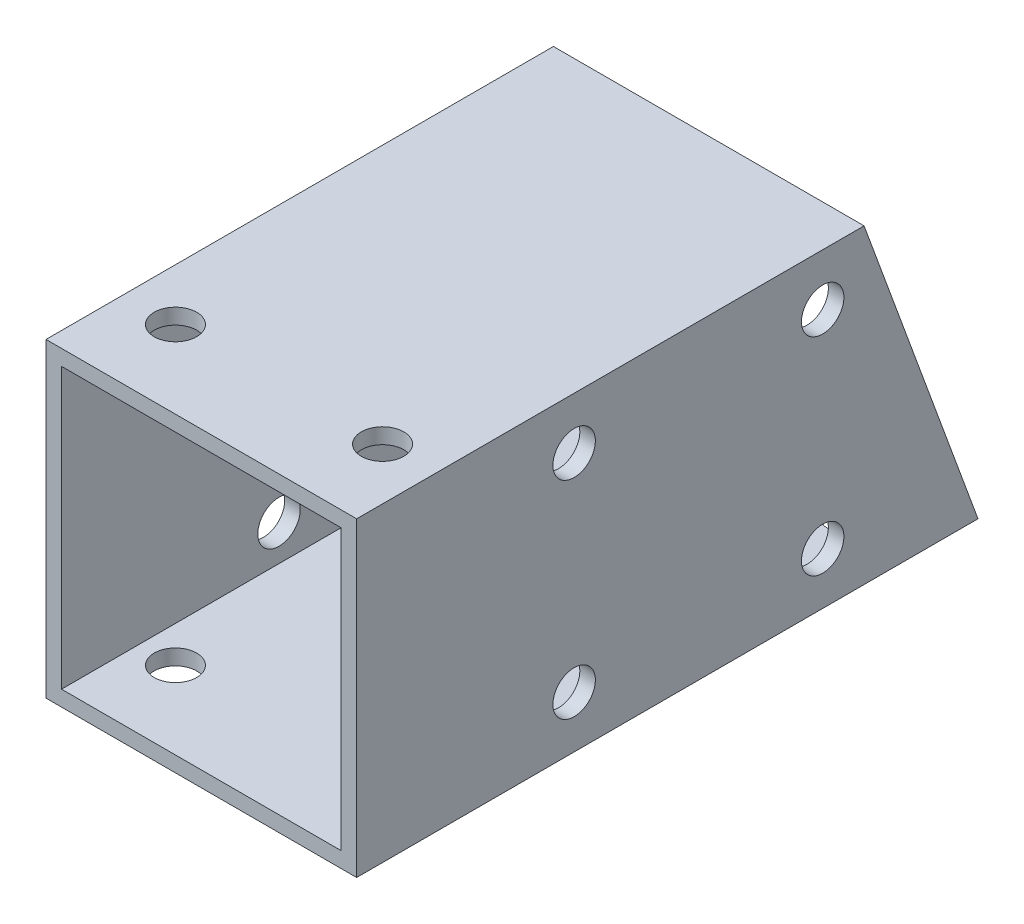
ISO-10303-21;
HEADER;
FILE_DESCRIPTION(('STEP AP214'),'2;1');
FILE_NAME('part.step','',(''),(''),'','','');
FILE_SCHEMA(('AUTOMOTIVE_DESIGN { 1 0 10303 214 1 1 1 1 }'));
ENDSEC;
DATA;
#1=APPLICATION_CONTEXT('core data for automotive mechanical design processes');
#2=APPLICATION_PROTOCOL_DEFINITION('international standard','automotive_design',2000,#1);
#3=PRODUCT_CONTEXT('',#1,'mechanical');
#4=PRODUCT('Part','Part','',(#3));
#5=PRODUCT_RELATED_PRODUCT_CATEGORY('part','',(#4));
#6=PRODUCT_DEFINITION_FORMATION('','',#4);
#7=PRODUCT_DEFINITION_CONTEXT('part definition',#1,'design');
#8=PRODUCT_DEFINITION('design','',#6,#7);
#9=PRODUCT_DEFINITION_SHAPE('','',#8);
#10=(LENGTH_UNIT() NAMED_UNIT(*) SI_UNIT(.MILLI.,.METRE.));
#11=(NAMED_UNIT(*) PLANE_ANGLE_UNIT() SI_UNIT($,.RADIAN.));
#12=(NAMED_UNIT(*) SI_UNIT($,.STERADIAN.) SOLID_ANGLE_UNIT());
#13=UNCERTAINTY_MEASURE_WITH_UNIT(LENGTH_MEASURE(1.E-05),#10,'distance_accuracy_value','');
#14=(GEOMETRIC_REPRESENTATION_CONTEXT(3) GLOBAL_UNCERTAINTY_ASSIGNED_CONTEXT((#13)) GLOBAL_UNIT_ASSIGNED_CONTEXT((#10,
#11,#12)) REPRESENTATION_CONTEXT('',''));
#15=CARTESIAN_POINT('',(0.,0.,0.));
#16=DIRECTION('',(0.,0.,1.));
#17=DIRECTION('',(1.,0.,0.));
#18=AXIS2_PLACEMENT_3D('',#15,#16,#17);
#19=CARTESIAN_POINT('',(0.,0.,60.));
#20=DIRECTION('',(0.,0.,1.));
#21=DIRECTION('',(1.,0.,0.));
#22=AXIS2_PLACEMENT_3D('',#19,#20,#21);
#23=PLANE('',#22);
#24=DIRECTION('',(0.,1.,0.));
#25=VECTOR('',#24,1.);
#26=CARTESIAN_POINT('',(15.,15.,60.));
#27=LINE('',#26,#25);
#28=CARTESIAN_POINT('',(15.,-15.,60.));
#29=VERTEX_POINT('',#28);
#30=CARTESIAN_POINT('',(15.,15.,60.));
#31=VERTEX_POINT('',#30);
#32=EDGE_CURVE('E214',#29,#31,#27,.T.);
#33=ORIENTED_EDGE('',*,*,#32,.T.);
#34=DIRECTION('',(-1.,0.,0.));
#35=VECTOR('',#34,1.);
#36=CARTESIAN_POINT('',(-15.,15.,60.));
#37=LINE('',#36,#35);
#38=CARTESIAN_POINT('',(-15.,15.,60.));
#39=VERTEX_POINT('',#38);
#40=EDGE_CURVE('E217',#31,#39,#37,.T.);
#41=ORIENTED_EDGE('',*,*,#40,.T.);
#42=DIRECTION('',(0.,-1.,0.));
#43=VECTOR('',#42,1.);
#44=CARTESIAN_POINT('',(-15.,15.,60.));
#45=LINE('',#44,#43);
#46=CARTESIAN_POINT('',(-15.,-15.,60.));
#47=VERTEX_POINT('',#46);
#48=EDGE_CURVE('E126',#39,#47,#45,.T.);
#49=ORIENTED_EDGE('',*,*,#48,.T.);
#50=DIRECTION('',(1.,0.,0.));
#51=VECTOR('',#50,1.);
#52=CARTESIAN_POINT('',(-15.,-15.,60.));
#53=LINE('',#52,#51);
#54=EDGE_CURVE('E220',#47,#29,#53,.T.);
#55=ORIENTED_EDGE('',*,*,#54,.T.);
#56=EDGE_LOOP('',(#33,#41,#49,#55));
#57=FACE_BOUND('',#56,.T.);
#58=DIRECTION('',(0.,-1.,0.));
#59=VECTOR('',#58,1.);
#60=CARTESIAN_POINT('',(-13.5,13.5,60.));
#61=LINE('',#60,#59);
#62=CARTESIAN_POINT('',(-13.5,13.5,60.));
#63=VERTEX_POINT('',#62);
#64=CARTESIAN_POINT('',(-13.5,-13.5,60.));
#65=VERTEX_POINT('',#64);
#66=EDGE_CURVE('E198',#63,#65,#61,.T.);
#67=ORIENTED_EDGE('',*,*,#66,.F.);
#68=DIRECTION('',(-1.,0.,0.));
#69=VECTOR('',#68,1.);
#70=CARTESIAN_POINT('',(-13.5,13.5,60.));
#71=LINE('',#70,#69);
#72=CARTESIAN_POINT('',(13.5,13.5,60.));
#73=VERTEX_POINT('',#72);
#74=EDGE_CURVE('E149',#73,#63,#71,.T.);
#75=ORIENTED_EDGE('',*,*,#74,.F.);
#76=DIRECTION('',(0.,1.,0.));
#77=VECTOR('',#76,1.);
#78=CARTESIAN_POINT('',(13.5,13.5,60.));
#79=LINE('',#78,#77);
#80=CARTESIAN_POINT('',(13.5,-13.5,60.));
#81=VERTEX_POINT('',#80);
#82=EDGE_CURVE('E202',#81,#73,#79,.T.);
#83=ORIENTED_EDGE('',*,*,#82,.F.);
#84=DIRECTION('',(1.,0.,0.));
#85=VECTOR('',#84,1.);
#86=CARTESIAN_POINT('',(-13.5,-13.5,60.));
#87=LINE('',#86,#85);
#88=EDGE_CURVE('E200',#65,#81,#87,.T.);
#89=ORIENTED_EDGE('',*,*,#88,.F.);
#90=EDGE_LOOP('',(#67,#75,#83,#89));
#91=FACE_BOUND('',#90,.T.);
#92=ADVANCED_FACE('F41',(#57,#91),#23,.T.);
#93=CARTESIAN_POINT('',(15.,15.,60.));
#94=DIRECTION('',(-1.,0.,0.));
#95=DIRECTION('',(0.,-1.,0.));
#96=AXIS2_PLACEMENT_3D('',#93,#94,#95);
#97=PLANE('',#96);
#98=CARTESIAN_POINT('',(15.,10.,15.));
#99=DIRECTION('',(1.,0.,0.));
#100=DIRECTION('',(0.,1.,0.));
#101=AXIS2_PLACEMENT_3D('',#98,#99,#100);
#102=CIRCLE('',#101,2.05);
#103=CARTESIAN_POINT('',(15.,12.05,15.));
#104=VERTEX_POINT('',#103);
#105=EDGE_CURVE('E267',#104,#104,#102,.T.);
#106=ORIENTED_EDGE('',*,*,#105,.F.);
#107=EDGE_LOOP('',(#106));
#108=FACE_BOUND('',#107,.T.);
#109=CARTESIAN_POINT('',(15.,-10.,15.));
#110=DIRECTION('',(1.,0.,0.));
#111=DIRECTION('',(0.,1.,0.));
#112=AXIS2_PLACEMENT_3D('',#109,#110,#111);
#113=CIRCLE('',#112,2.05);
#114=CARTESIAN_POINT('',(15.,-7.95,15.));
#115=VERTEX_POINT('',#114);
#116=EDGE_CURVE('E261',#115,#115,#113,.T.);
#117=ORIENTED_EDGE('',*,*,#116,.F.);
#118=EDGE_LOOP('',(#117));
#119=FACE_BOUND('',#118,.T.);
#120=CARTESIAN_POINT('',(15.,-10.,39.));
#121=DIRECTION('',(1.,0.,0.));
#122=DIRECTION('',(0.,1.,0.));
#123=AXIS2_PLACEMENT_3D('',#120,#121,#122);
#124=CIRCLE('',#123,2.05);
#125=CARTESIAN_POINT('',(15.,-7.95,39.));
#126=VERTEX_POINT('',#125);
#127=EDGE_CURVE('E254',#126,#126,#124,.T.);
#128=ORIENTED_EDGE('',*,*,#127,.F.);
#129=EDGE_LOOP('',(#128));
#130=FACE_BOUND('',#129,.T.);
#131=CARTESIAN_POINT('',(15.,10.,39.));
#132=DIRECTION('',(1.,0.,0.));
#133=DIRECTION('',(0.,1.,0.));
#134=AXIS2_PLACEMENT_3D('',#131,#132,#133);
#135=CIRCLE('',#134,2.05);
#136=CARTESIAN_POINT('',(15.,12.05,39.));
#137=VERTEX_POINT('',#136);
#138=EDGE_CURVE('E257',#137,#137,#135,.T.);
#139=ORIENTED_EDGE('',*,*,#138,.F.);
#140=EDGE_LOOP('',(#139));
#141=FACE_BOUND('',#140,.T.);
#142=DIRECTION('',(0.,0.,-1.));
#143=VECTOR('',#142,1.);
#144=CARTESIAN_POINT('',(15.,-15.,60.));
#145=LINE('',#144,#143);
#146=CARTESIAN_POINT('',(15.,-15.,0.));
#147=VERTEX_POINT('',#146);
#148=EDGE_CURVE('E130',#29,#147,#145,.T.);
#149=ORIENTED_EDGE('',*,*,#148,.T.);
#150=DIRECTION('',(0.,-0.938876315886608,-0.344254649158423));
#151=VECTOR('',#150,1.);
#152=CARTESIAN_POINT('',(15.,-15.,0.));
#153=LINE('',#152,#151);
#154=CARTESIAN_POINT('',(15.,15.,11.));
#155=VERTEX_POINT('',#154);
#156=EDGE_CURVE('E115',#155,#147,#153,.T.);
#157=ORIENTED_EDGE('',*,*,#156,.F.);
#158=DIRECTION('',(0.,0.,-1.));
#159=VECTOR('',#158,1.);
#160=CARTESIAN_POINT('',(15.,15.,60.));
#161=LINE('',#160,#159);
#162=EDGE_CURVE('E49',#31,#155,#161,.T.);
#163=ORIENTED_EDGE('',*,*,#162,.F.);
#164=ORIENTED_EDGE('',*,*,#32,.F.);
#165=EDGE_LOOP('',(#149,#157,#163,#164));
#166=FACE_BOUND('',#165,.T.);
#167=ADVANCED_FACE('F43',(#108,#119,#130,#141,#166),#97,.F.);
#168=CARTESIAN_POINT('',(-15.,15.,60.));
#169=DIRECTION('',(0.,-1.,0.));
#170=DIRECTION('',(1.,0.,0.));
#171=AXIS2_PLACEMENT_3D('',#168,#169,#170);
#172=PLANE('',#171);
#173=CARTESIAN_POINT('',(-9.99999999999999,15.,52.5));
#174=DIRECTION('',(0.,1.,0.));
#175=DIRECTION('',(0.,0.,1.));
#176=AXIS2_PLACEMENT_3D('',#173,#174,#175);
#177=CIRCLE('',#176,2.05);
#178=CARTESIAN_POINT('',(-9.99999999999999,15.,54.55));
#179=VERTEX_POINT('',#178);
#180=EDGE_CURVE('E186',#179,#179,#177,.T.);
#181=ORIENTED_EDGE('',*,*,#180,.F.);
#182=EDGE_LOOP('',(#181));
#183=FACE_BOUND('',#182,.T.);
#184=CARTESIAN_POINT('',(10.,15.,52.5));
#185=DIRECTION('',(0.,1.,0.));
#186=DIRECTION('',(0.,0.,1.));
#187=AXIS2_PLACEMENT_3D('',#184,#185,#186);
#188=CIRCLE('',#187,2.05);
#189=CARTESIAN_POINT('',(10.,15.,54.55));
#190=VERTEX_POINT('',#189);
#191=EDGE_CURVE('E177',#190,#190,#188,.T.);
#192=ORIENTED_EDGE('',*,*,#191,.F.);
#193=EDGE_LOOP('',(#192));
#194=FACE_BOUND('',#193,.T.);
#195=ORIENTED_EDGE('',*,*,#162,.T.);
#196=DIRECTION('',(1.,0.,0.));
#197=VECTOR('',#196,1.);
#198=CARTESIAN_POINT('',(-15.,15.,11.));
#199=LINE('',#198,#197);
#200=CARTESIAN_POINT('',(-15.,15.,11.));
#201=VERTEX_POINT('',#200);
#202=EDGE_CURVE('E107',#201,#155,#199,.T.);
#203=ORIENTED_EDGE('',*,*,#202,.F.);
#204=DIRECTION('',(0.,0.,-1.));
#205=VECTOR('',#204,1.);
#206=CARTESIAN_POINT('',(-15.,15.,60.));
#207=LINE('',#206,#205);
#208=EDGE_CURVE('E121',#39,#201,#207,.T.);
#209=ORIENTED_EDGE('',*,*,#208,.F.);
#210=ORIENTED_EDGE('',*,*,#40,.F.);
#211=EDGE_LOOP('',(#195,#203,#209,#210));
#212=FACE_BOUND('',#211,.T.);
#213=ADVANCED_FACE('F120',(#183,#194,#212),#172,.F.);
#214=CARTESIAN_POINT('',(-15.,15.,60.));
#215=DIRECTION('',(1.,0.,0.));
#216=DIRECTION('',(0.,1.,0.));
#217=AXIS2_PLACEMENT_3D('',#214,#215,#216);
#218=PLANE('',#217);
#219=CARTESIAN_POINT('',(-15.,10.,15.));
#220=DIRECTION('',(1.,0.,0.));
#221=DIRECTION('',(0.,1.,0.));
#222=AXIS2_PLACEMENT_3D('',#219,#220,#221);
#223=CIRCLE('',#222,2.05);
#224=CARTESIAN_POINT('',(-15.,12.05,15.));
#225=VERTEX_POINT('',#224);
#226=EDGE_CURVE('E253',#225,#225,#223,.T.);
#227=ORIENTED_EDGE('',*,*,#226,.T.);
#228=EDGE_LOOP('',(#227));
#229=FACE_BOUND('',#228,.T.);
#230=CARTESIAN_POINT('',(-15.,-10.,15.));
#231=DIRECTION('',(1.,0.,0.));
#232=DIRECTION('',(0.,1.,0.));
#233=AXIS2_PLACEMENT_3D('',#230,#231,#232);
#234=CIRCLE('',#233,2.05);
#235=CARTESIAN_POINT('',(-15.,-7.95,15.));
#236=VERTEX_POINT('',#235);
#237=EDGE_CURVE('E264',#236,#236,#234,.T.);
#238=ORIENTED_EDGE('',*,*,#237,.T.);
#239=EDGE_LOOP('',(#238));
#240=FACE_BOUND('',#239,.T.);
#241=CARTESIAN_POINT('',(-15.,-10.,39.));
#242=DIRECTION('',(1.,0.,0.));
#243=DIRECTION('',(0.,1.,0.));
#244=AXIS2_PLACEMENT_3D('',#241,#242,#243);
#245=CIRCLE('',#244,2.05);
#246=CARTESIAN_POINT('',(-15.,-7.95,39.));
#247=VERTEX_POINT('',#246);
#248=EDGE_CURVE('E258',#247,#247,#245,.T.);
#249=ORIENTED_EDGE('',*,*,#248,.T.);
#250=EDGE_LOOP('',(#249));
#251=FACE_BOUND('',#250,.T.);
#252=CARTESIAN_POINT('',(-15.,10.,39.));
#253=DIRECTION('',(1.,0.,0.));
#254=DIRECTION('',(0.,1.,0.));
#255=AXIS2_PLACEMENT_3D('',#252,#253,#254);
#256=CIRCLE('',#255,2.05);
#257=CARTESIAN_POINT('',(-15.,12.05,39.));
#258=VERTEX_POINT('',#257);
#259=EDGE_CURVE('E154',#258,#258,#256,.T.);
#260=ORIENTED_EDGE('',*,*,#259,.T.);
#261=EDGE_LOOP('',(#260));
#262=FACE_BOUND('',#261,.T.);
#263=ORIENTED_EDGE('',*,*,#208,.T.);
#264=DIRECTION('',(0.,-0.938876315886608,-0.344254649158423));
#265=VECTOR('',#264,1.);
#266=CARTESIAN_POINT('',(-15.,-15.,0.));
#267=LINE('',#266,#265);
#268=CARTESIAN_POINT('',(-15.,-15.,0.));
#269=VERTEX_POINT('',#268);
#270=EDGE_CURVE('E104',#201,#269,#267,.T.);
#271=ORIENTED_EDGE('',*,*,#270,.T.);
#272=DIRECTION('',(0.,0.,-1.));
#273=VECTOR('',#272,1.);
#274=CARTESIAN_POINT('',(-15.,-15.,60.));
#275=LINE('',#274,#273);
#276=EDGE_CURVE('E127',#47,#269,#275,.T.);
#277=ORIENTED_EDGE('',*,*,#276,.F.);
#278=ORIENTED_EDGE('',*,*,#48,.F.);
#279=EDGE_LOOP('',(#263,#271,#277,#278));
#280=FACE_BOUND('',#279,.T.);
#281=ADVANCED_FACE('F125',(#229,#240,#251,#262,#280),#218,.F.);
#282=CARTESIAN_POINT('',(-15.,-15.,60.));
#283=DIRECTION('',(0.,1.,0.));
#284=DIRECTION('',(0.,0.,1.));
#285=AXIS2_PLACEMENT_3D('',#282,#283,#284);
#286=PLANE('',#285);
#287=CARTESIAN_POINT('',(10.,-15.,7.50000000000001));
#288=DIRECTION('',(0.,1.,0.));
#289=DIRECTION('',(0.,0.,1.));
#290=AXIS2_PLACEMENT_3D('',#287,#288,#289);
#291=CIRCLE('',#290,2.05);
#292=CARTESIAN_POINT('',(10.,-15.,9.55000000000001));
#293=VERTEX_POINT('',#292);
#294=EDGE_CURVE('E183',#293,#293,#291,.T.);
#295=ORIENTED_EDGE('',*,*,#294,.T.);
#296=EDGE_LOOP('',(#295));
#297=FACE_BOUND('',#296,.T.);
#298=CARTESIAN_POINT('',(-9.99999999999999,-15.,52.5));
#299=DIRECTION('',(0.,1.,0.));
#300=DIRECTION('',(0.,0.,1.));
#301=AXIS2_PLACEMENT_3D('',#298,#299,#300);
#302=CIRCLE('',#301,2.05);
#303=CARTESIAN_POINT('',(-9.99999999999999,-15.,54.55));
#304=VERTEX_POINT('',#303);
#305=EDGE_CURVE('E180',#304,#304,#302,.T.);
#306=ORIENTED_EDGE('',*,*,#305,.T.);
#307=EDGE_LOOP('',(#306));
#308=FACE_BOUND('',#307,.T.);
#309=CARTESIAN_POINT('',(10.,-15.,52.5));
#310=DIRECTION('',(0.,1.,0.));
#311=DIRECTION('',(0.,0.,1.));
#312=AXIS2_PLACEMENT_3D('',#309,#310,#311);
#313=CIRCLE('',#312,2.05);
#314=CARTESIAN_POINT('',(10.,-15.,54.55));
#315=VERTEX_POINT('',#314);
#316=EDGE_CURVE('E168',#315,#315,#313,.T.);
#317=ORIENTED_EDGE('',*,*,#316,.T.);
#318=EDGE_LOOP('',(#317));
#319=FACE_BOUND('',#318,.T.);
#320=CARTESIAN_POINT('',(-9.99999999999999,-15.,7.50000000000001));
#321=DIRECTION('',(0.,1.,0.));
#322=DIRECTION('',(0.,0.,1.));
#323=AXIS2_PLACEMENT_3D('',#320,#321,#322);
#324=CIRCLE('',#323,2.05);
#325=CARTESIAN_POINT('',(-9.99999999999999,-15.,9.55000000000001));
#326=VERTEX_POINT('',#325);
#327=EDGE_CURVE('E138',#326,#326,#324,.T.);
#328=ORIENTED_EDGE('',*,*,#327,.T.);
#329=EDGE_LOOP('',(#328));
#330=FACE_BOUND('',#329,.T.);
#331=DIRECTION('',(1.,0.,0.));
#332=VECTOR('',#331,1.);
#333=CARTESIAN_POINT('',(-15.,-15.,0.));
#334=LINE('',#333,#332);
#335=EDGE_CURVE('E110',#269,#147,#334,.T.);
#336=ORIENTED_EDGE('',*,*,#335,.T.);
#337=ORIENTED_EDGE('',*,*,#148,.F.);
#338=ORIENTED_EDGE('',*,*,#54,.F.);
#339=ORIENTED_EDGE('',*,*,#276,.T.);
#340=EDGE_LOOP('',(#336,#337,#338,#339));
#341=FACE_BOUND('',#340,.T.);
#342=ADVANCED_FACE('F228',(#297,#308,#319,#330,#341),#286,.F.);
#343=CARTESIAN_POINT('',(-13.5,13.5,60.));
#344=DIRECTION('',(0.,-1.,0.));
#345=DIRECTION('',(0.,0.,-1.));
#346=AXIS2_PLACEMENT_3D('',#343,#344,#345);
#347=PLANE('',#346);
#348=DIRECTION('',(-1.,0.,0.));
#349=VECTOR('',#348,1.);
#350=CARTESIAN_POINT('',(-13.5,13.5,10.45));
#351=LINE('',#350,#349);
#352=CARTESIAN_POINT('',(13.5,13.5,10.45));
#353=VERTEX_POINT('',#352);
#354=CARTESIAN_POINT('',(-13.5,13.5,10.45));
#355=VERTEX_POINT('',#354);
#356=EDGE_CURVE('E248',#353,#355,#351,.T.);
#357=ORIENTED_EDGE('',*,*,#356,.F.);
#358=DIRECTION('',(0.,0.,-1.));
#359=VECTOR('',#358,1.);
#360=CARTESIAN_POINT('',(13.5,13.5,60.));
#361=LINE('',#360,#359);
#362=EDGE_CURVE('E204',#73,#353,#361,.T.);
#363=ORIENTED_EDGE('',*,*,#362,.F.);
#364=ORIENTED_EDGE('',*,*,#74,.T.);
#365=DIRECTION('',(0.,0.,-1.));
#366=VECTOR('',#365,1.);
#367=CARTESIAN_POINT('',(-13.5,13.5,60.));
#368=LINE('',#367,#366);
#369=EDGE_CURVE('E211',#63,#355,#368,.T.);
#370=ORIENTED_EDGE('',*,*,#369,.T.);
#371=EDGE_LOOP('',(#357,#363,#364,#370));
#372=FACE_BOUND('',#371,.T.);
#373=CARTESIAN_POINT('',(-9.99999999999999,13.5,52.5));
#374=DIRECTION('',(0.,-1.,0.));
#375=DIRECTION('',(0.,0.,-1.));
#376=AXIS2_PLACEMENT_3D('',#373,#374,#375);
#377=CIRCLE('',#376,2.05);
#378=CARTESIAN_POINT('',(-9.99999999999999,13.5,50.45));
#379=VERTEX_POINT('',#378);
#380=EDGE_CURVE('E145',#379,#379,#377,.T.);
#381=ORIENTED_EDGE('',*,*,#380,.F.);
#382=EDGE_LOOP('',(#381));
#383=FACE_BOUND('',#382,.T.);
#384=CARTESIAN_POINT('',(10.,13.5,52.5));
#385=DIRECTION('',(0.,-1.,0.));
#386=DIRECTION('',(0.,0.,-1.));
#387=AXIS2_PLACEMENT_3D('',#384,#385,#386);
#388=CIRCLE('',#387,2.05);
#389=CARTESIAN_POINT('',(10.,13.5,50.45));
#390=VERTEX_POINT('',#389);
#391=EDGE_CURVE('E141',#390,#390,#388,.T.);
#392=ORIENTED_EDGE('',*,*,#391,.F.);
#393=EDGE_LOOP('',(#392));
#394=FACE_BOUND('',#393,.T.);
#395=ADVANCED_FACE('F282',(#372,#383,#394),#347,.T.);
#396=CARTESIAN_POINT('',(-13.5,13.5,60.));
#397=DIRECTION('',(1.,0.,0.));
#398=DIRECTION('',(0.,1.,0.));
#399=AXIS2_PLACEMENT_3D('',#396,#397,#398);
#400=PLANE('',#399);
#401=DIRECTION('',(0.,-0.938876315886609,-0.344254649158423));
#402=VECTOR('',#401,1.);
#403=CARTESIAN_POINT('',(-13.5,29.515181194907,16.3222331047992));
#404=LINE('',#403,#402);
#405=CARTESIAN_POINT('',(-13.5,-13.5,0.549999999999995));
#406=VERTEX_POINT('',#405);
#407=EDGE_CURVE('E246',#355,#406,#404,.T.);
#408=ORIENTED_EDGE('',*,*,#407,.F.);
#409=ORIENTED_EDGE('',*,*,#369,.F.);
#410=ORIENTED_EDGE('',*,*,#66,.T.);
#411=DIRECTION('',(0.,0.,-1.));
#412=VECTOR('',#411,1.);
#413=CARTESIAN_POINT('',(-13.5,-13.5,60.));
#414=LINE('',#413,#412);
#415=EDGE_CURVE('E208',#65,#406,#414,.T.);
#416=ORIENTED_EDGE('',*,*,#415,.T.);
#417=EDGE_LOOP('',(#408,#409,#410,#416));
#418=FACE_BOUND('',#417,.T.);
#419=CARTESIAN_POINT('',(-13.5,10.,15.));
#420=DIRECTION('',(1.,0.,0.));
#421=DIRECTION('',(0.,1.,0.));
#422=AXIS2_PLACEMENT_3D('',#419,#420,#421);
#423=CIRCLE('',#422,2.05);
#424=CARTESIAN_POINT('',(-13.5,12.05,15.));
#425=VERTEX_POINT('',#424);
#426=EDGE_CURVE('E164',#425,#425,#423,.T.);
#427=ORIENTED_EDGE('',*,*,#426,.F.);
#428=EDGE_LOOP('',(#427));
#429=FACE_BOUND('',#428,.T.);
#430=CARTESIAN_POINT('',(-13.5,-10.,15.));
#431=DIRECTION('',(1.,0.,0.));
#432=DIRECTION('',(0.,1.,0.));
#433=AXIS2_PLACEMENT_3D('',#430,#431,#432);
#434=CIRCLE('',#433,2.05);
#435=CARTESIAN_POINT('',(-13.5,-7.95,15.));
#436=VERTEX_POINT('',#435);
#437=EDGE_CURVE('E161',#436,#436,#434,.T.);
#438=ORIENTED_EDGE('',*,*,#437,.F.);
#439=EDGE_LOOP('',(#438));
#440=FACE_BOUND('',#439,.T.);
#441=CARTESIAN_POINT('',(-13.5,-10.,39.));
#442=DIRECTION('',(1.,0.,0.));
#443=DIRECTION('',(0.,1.,0.));
#444=AXIS2_PLACEMENT_3D('',#441,#442,#443);
#445=CIRCLE('',#444,2.05);
#446=CARTESIAN_POINT('',(-13.5,-7.95,39.));
#447=VERTEX_POINT('',#446);
#448=EDGE_CURVE('E158',#447,#447,#445,.T.);
#449=ORIENTED_EDGE('',*,*,#448,.F.);
#450=EDGE_LOOP('',(#449));
#451=FACE_BOUND('',#450,.T.);
#452=CARTESIAN_POINT('',(-13.5,10.,39.));
#453=DIRECTION('',(1.,0.,0.));
#454=DIRECTION('',(0.,1.,0.));
#455=AXIS2_PLACEMENT_3D('',#452,#453,#454);
#456=CIRCLE('',#455,2.05);
#457=CARTESIAN_POINT('',(-13.5,12.05,39.));
#458=VERTEX_POINT('',#457);
#459=EDGE_CURVE('E153',#458,#458,#456,.T.);
#460=ORIENTED_EDGE('',*,*,#459,.F.);
#461=EDGE_LOOP('',(#460));
#462=FACE_BOUND('',#461,.T.);
#463=ADVANCED_FACE('F241',(#418,#429,#440,#451,#462),#400,.T.);
#464=CARTESIAN_POINT('',(-13.5,-13.5,60.));
#465=DIRECTION('',(0.,1.,0.));
#466=DIRECTION('',(0.,0.,1.));
#467=AXIS2_PLACEMENT_3D('',#464,#465,#466);
#468=PLANE('',#467);
#469=DIRECTION('',(1.,0.,0.));
#470=VECTOR('',#469,1.);
#471=CARTESIAN_POINT('',(-13.5,-13.5,0.549999999999995));
#472=LINE('',#471,#470);
#473=CARTESIAN_POINT('',(13.5,-13.5,0.55));
#474=VERTEX_POINT('',#473);
#475=EDGE_CURVE('E55',#406,#474,#472,.T.);
#476=ORIENTED_EDGE('',*,*,#475,.F.);
#477=ORIENTED_EDGE('',*,*,#415,.F.);
#478=ORIENTED_EDGE('',*,*,#88,.T.);
#479=DIRECTION('',(0.,0.,-1.));
#480=VECTOR('',#479,1.);
#481=CARTESIAN_POINT('',(13.5,-13.5,60.));
#482=LINE('',#481,#480);
#483=EDGE_CURVE('E62',#81,#474,#482,.T.);
#484=ORIENTED_EDGE('',*,*,#483,.T.);
#485=EDGE_LOOP('',(#476,#477,#478,#484));
#486=FACE_BOUND('',#485,.T.);
#487=CARTESIAN_POINT('',(10.,-13.5,7.50000000000001));
#488=DIRECTION('',(0.,1.,0.));
#489=DIRECTION('',(0.,0.,1.));
#490=AXIS2_PLACEMENT_3D('',#487,#488,#489);
#491=CIRCLE('',#490,2.05);
#492=CARTESIAN_POINT('',(10.,-13.5,9.55000000000001));
#493=VERTEX_POINT('',#492);
#494=EDGE_CURVE('E146',#493,#493,#491,.T.);
#495=ORIENTED_EDGE('',*,*,#494,.F.);
#496=EDGE_LOOP('',(#495));
#497=FACE_BOUND('',#496,.T.);
#498=CARTESIAN_POINT('',(-9.99999999999999,-13.5,52.5));
#499=DIRECTION('',(0.,1.,0.));
#500=DIRECTION('',(0.,0.,1.));
#501=AXIS2_PLACEMENT_3D('',#498,#499,#500);
#502=CIRCLE('',#501,2.05);
#503=CARTESIAN_POINT('',(-9.99999999999999,-13.5,54.55));
#504=VERTEX_POINT('',#503);
#505=EDGE_CURVE('E142',#504,#504,#502,.T.);
#506=ORIENTED_EDGE('',*,*,#505,.F.);
#507=EDGE_LOOP('',(#506));
#508=FACE_BOUND('',#507,.T.);
#509=CARTESIAN_POINT('',(10.,-13.5,52.5));
#510=DIRECTION('',(0.,1.,0.));
#511=DIRECTION('',(0.,0.,1.));
#512=AXIS2_PLACEMENT_3D('',#509,#510,#511);
#513=CIRCLE('',#512,2.05);
#514=CARTESIAN_POINT('',(10.,-13.5,54.55));
#515=VERTEX_POINT('',#514);
#516=EDGE_CURVE('E137',#515,#515,#513,.T.);
#517=ORIENTED_EDGE('',*,*,#516,.F.);
#518=EDGE_LOOP('',(#517));
#519=FACE_BOUND('',#518,.T.);
#520=CARTESIAN_POINT('',(-9.99999999999999,-13.5,7.50000000000001));
#521=DIRECTION('',(0.,1.,0.));
#522=DIRECTION('',(0.,0.,1.));
#523=AXIS2_PLACEMENT_3D('',#520,#521,#522);
#524=CIRCLE('',#523,2.05);
#525=CARTESIAN_POINT('',(-9.99999999999999,-13.5,9.55000000000001));
#526=VERTEX_POINT('',#525);
#527=EDGE_CURVE('E134',#526,#526,#524,.T.);
#528=ORIENTED_EDGE('',*,*,#527,.F.);
#529=EDGE_LOOP('',(#528));
#530=FACE_BOUND('',#529,.T.);
#531=ADVANCED_FACE('F244',(#486,#497,#508,#519,#530),#468,.T.);
#532=CARTESIAN_POINT('',(13.5,13.5,60.));
#533=DIRECTION('',(-1.,0.,0.));
#534=DIRECTION('',(0.,-1.,0.));
#535=AXIS2_PLACEMENT_3D('',#532,#533,#534);
#536=PLANE('',#535);
#537=DIRECTION('',(0.,0.938876315886609,0.344254649158423));
#538=VECTOR('',#537,1.);
#539=CARTESIAN_POINT('',(13.5,29.515181194907,16.3222331047992));
#540=LINE('',#539,#538);
#541=EDGE_CURVE('E11',#474,#353,#540,.T.);
#542=ORIENTED_EDGE('',*,*,#541,.F.);
#543=ORIENTED_EDGE('',*,*,#483,.F.);
#544=ORIENTED_EDGE('',*,*,#82,.T.);
#545=ORIENTED_EDGE('',*,*,#362,.T.);
#546=EDGE_LOOP('',(#542,#543,#544,#545));
#547=FACE_BOUND('',#546,.T.);
#548=CARTESIAN_POINT('',(13.5,10.,15.));
#549=DIRECTION('',(-1.,0.,0.));
#550=DIRECTION('',(0.,-1.,0.));
#551=AXIS2_PLACEMENT_3D('',#548,#549,#550);
#552=CIRCLE('',#551,2.05);
#553=CARTESIAN_POINT('',(13.5,7.95,15.));
#554=VERTEX_POINT('',#553);
#555=EDGE_CURVE('E162',#554,#554,#552,.T.);
#556=ORIENTED_EDGE('',*,*,#555,.F.);
#557=EDGE_LOOP('',(#556));
#558=FACE_BOUND('',#557,.T.);
#559=CARTESIAN_POINT('',(13.5,-10.,15.));
#560=DIRECTION('',(-1.,0.,0.));
#561=DIRECTION('',(0.,-1.,0.));
#562=AXIS2_PLACEMENT_3D('',#559,#560,#561);
#563=CIRCLE('',#562,2.05);
#564=CARTESIAN_POINT('',(13.5,-12.05,15.));
#565=VERTEX_POINT('',#564);
#566=EDGE_CURVE('E159',#565,#565,#563,.T.);
#567=ORIENTED_EDGE('',*,*,#566,.F.);
#568=EDGE_LOOP('',(#567));
#569=FACE_BOUND('',#568,.T.);
#570=CARTESIAN_POINT('',(13.5,-10.,39.));
#571=DIRECTION('',(-1.,0.,0.));
#572=DIRECTION('',(0.,-1.,0.));
#573=AXIS2_PLACEMENT_3D('',#570,#571,#572);
#574=CIRCLE('',#573,2.05);
#575=CARTESIAN_POINT('',(13.5,-12.05,39.));
#576=VERTEX_POINT('',#575);
#577=EDGE_CURVE('E155',#576,#576,#574,.T.);
#578=ORIENTED_EDGE('',*,*,#577,.F.);
#579=EDGE_LOOP('',(#578));
#580=FACE_BOUND('',#579,.T.);
#581=CARTESIAN_POINT('',(13.5,10.,39.));
#582=DIRECTION('',(-1.,0.,0.));
#583=DIRECTION('',(0.,-1.,0.));
#584=AXIS2_PLACEMENT_3D('',#581,#582,#583);
#585=CIRCLE('',#584,2.05);
#586=CARTESIAN_POINT('',(13.5,7.95,39.));
#587=VERTEX_POINT('',#586);
#588=EDGE_CURVE('E150',#587,#587,#585,.T.);
#589=ORIENTED_EDGE('',*,*,#588,.F.);
#590=EDGE_LOOP('',(#589));
#591=FACE_BOUND('',#590,.T.);
#592=ADVANCED_FACE('F288',(#547,#558,#569,#580,#591),#536,.T.);
#593=CARTESIAN_POINT('',(-9.99999999999999,-15.,7.50000000000001));
#594=DIRECTION('',(0.,1.,0.));
#595=DIRECTION('',(0.,0.,1.));
#596=AXIS2_PLACEMENT_3D('',#593,#594,#595);
#597=CYLINDRICAL_SURFACE('',#596,2.05);
#598=ORIENTED_EDGE('',*,*,#527,.T.);
#599=EDGE_LOOP('',(#598));
#600=FACE_BOUND('',#599,.T.);
#601=ORIENTED_EDGE('',*,*,#327,.F.);
#602=EDGE_LOOP('',(#601));
#603=FACE_BOUND('',#602,.T.);
#604=ADVANCED_FACE('F328',(#600,#603),#597,.F.);
#605=CARTESIAN_POINT('',(10.,-15.,52.5));
#606=DIRECTION('',(0.,1.,0.));
#607=DIRECTION('',(0.,0.,1.));
#608=AXIS2_PLACEMENT_3D('',#605,#606,#607);
#609=CYLINDRICAL_SURFACE('',#608,2.05);
#610=ORIENTED_EDGE('',*,*,#516,.T.);
#611=EDGE_LOOP('',(#610));
#612=FACE_BOUND('',#611,.T.);
#613=ORIENTED_EDGE('',*,*,#316,.F.);
#614=EDGE_LOOP('',(#613));
#615=FACE_BOUND('',#614,.T.);
#616=ADVANCED_FACE('F315',(#612,#615),#609,.F.);
#617=CARTESIAN_POINT('',(-9.99999999999999,-15.,52.5));
#618=DIRECTION('',(0.,1.,0.));
#619=DIRECTION('',(0.,0.,1.));
#620=AXIS2_PLACEMENT_3D('',#617,#618,#619);
#621=CYLINDRICAL_SURFACE('',#620,2.05);
#622=ORIENTED_EDGE('',*,*,#505,.T.);
#623=EDGE_LOOP('',(#622));
#624=FACE_BOUND('',#623,.T.);
#625=ORIENTED_EDGE('',*,*,#305,.F.);
#626=EDGE_LOOP('',(#625));
#627=FACE_BOUND('',#626,.T.);
#628=ADVANCED_FACE('F323',(#624,#627),#621,.F.);
#629=CARTESIAN_POINT('',(10.,-15.,7.50000000000001));
#630=DIRECTION('',(0.,1.,0.));
#631=DIRECTION('',(0.,0.,1.));
#632=AXIS2_PLACEMENT_3D('',#629,#630,#631);
#633=CYLINDRICAL_SURFACE('',#632,2.05);
#634=ORIENTED_EDGE('',*,*,#494,.T.);
#635=EDGE_LOOP('',(#634));
#636=FACE_BOUND('',#635,.T.);
#637=ORIENTED_EDGE('',*,*,#294,.F.);
#638=EDGE_LOOP('',(#637));
#639=FACE_BOUND('',#638,.T.);
#640=ADVANCED_FACE('F312',(#636,#639),#633,.F.);
#641=ORIENTED_EDGE('',*,*,#391,.T.);
#642=EDGE_LOOP('',(#641));
#643=FACE_BOUND('',#642,.T.);
#644=ORIENTED_EDGE('',*,*,#191,.T.);
#645=EDGE_LOOP('',(#644));
#646=FACE_BOUND('',#645,.T.);
#647=ADVANCED_FACE('F309',(#643,#646),#609,.F.);
#648=ORIENTED_EDGE('',*,*,#380,.T.);
#649=EDGE_LOOP('',(#648));
#650=FACE_BOUND('',#649,.T.);
#651=ORIENTED_EDGE('',*,*,#180,.T.);
#652=EDGE_LOOP('',(#651));
#653=FACE_BOUND('',#652,.T.);
#654=ADVANCED_FACE('F311',(#650,#653),#621,.F.);
#655=CARTESIAN_POINT('',(-15.,10.,39.));
#656=DIRECTION('',(1.,0.,0.));
#657=DIRECTION('',(0.,1.,0.));
#658=AXIS2_PLACEMENT_3D('',#655,#656,#657);
#659=CYLINDRICAL_SURFACE('',#658,2.05);
#660=ORIENTED_EDGE('',*,*,#588,.T.);
#661=EDGE_LOOP('',(#660));
#662=FACE_BOUND('',#661,.T.);
#663=ORIENTED_EDGE('',*,*,#138,.T.);
#664=EDGE_LOOP('',(#663));
#665=FACE_BOUND('',#664,.T.);
#666=ADVANCED_FACE('F320',(#662,#665),#659,.F.);
#667=CARTESIAN_POINT('',(-15.,-10.,39.));
#668=DIRECTION('',(1.,0.,0.));
#669=DIRECTION('',(0.,1.,0.));
#670=AXIS2_PLACEMENT_3D('',#667,#668,#669);
#671=CYLINDRICAL_SURFACE('',#670,2.05);
#672=ORIENTED_EDGE('',*,*,#577,.T.);
#673=EDGE_LOOP('',(#672));
#674=FACE_BOUND('',#673,.T.);
#675=ORIENTED_EDGE('',*,*,#127,.T.);
#676=EDGE_LOOP('',(#675));
#677=FACE_BOUND('',#676,.T.);
#678=ADVANCED_FACE('F363',(#674,#677),#671,.F.);
#679=CARTESIAN_POINT('',(-15.,-10.,15.));
#680=DIRECTION('',(1.,0.,0.));
#681=DIRECTION('',(0.,1.,0.));
#682=AXIS2_PLACEMENT_3D('',#679,#680,#681);
#683=CYLINDRICAL_SURFACE('',#682,2.05);
#684=ORIENTED_EDGE('',*,*,#566,.T.);
#685=EDGE_LOOP('',(#684));
#686=FACE_BOUND('',#685,.T.);
#687=ORIENTED_EDGE('',*,*,#116,.T.);
#688=EDGE_LOOP('',(#687));
#689=FACE_BOUND('',#688,.T.);
#690=ADVANCED_FACE('F369',(#686,#689),#683,.F.);
#691=CARTESIAN_POINT('',(-15.,10.,15.));
#692=DIRECTION('',(1.,0.,0.));
#693=DIRECTION('',(0.,1.,0.));
#694=AXIS2_PLACEMENT_3D('',#691,#692,#693);
#695=CYLINDRICAL_SURFACE('',#694,2.05);
#696=ORIENTED_EDGE('',*,*,#555,.T.);
#697=EDGE_LOOP('',(#696));
#698=FACE_BOUND('',#697,.T.);
#699=ORIENTED_EDGE('',*,*,#105,.T.);
#700=EDGE_LOOP('',(#699));
#701=FACE_BOUND('',#700,.T.);
#702=ADVANCED_FACE('F375',(#698,#701),#695,.F.);
#703=ORIENTED_EDGE('',*,*,#459,.T.);
#704=EDGE_LOOP('',(#703));
#705=FACE_BOUND('',#704,.T.);
#706=ORIENTED_EDGE('',*,*,#259,.F.);
#707=EDGE_LOOP('',(#706));
#708=FACE_BOUND('',#707,.T.);
#709=ADVANCED_FACE('F278',(#705,#708),#659,.F.);
#710=ORIENTED_EDGE('',*,*,#448,.T.);
#711=EDGE_LOOP('',(#710));
#712=FACE_BOUND('',#711,.T.);
#713=ORIENTED_EDGE('',*,*,#248,.F.);
#714=EDGE_LOOP('',(#713));
#715=FACE_BOUND('',#714,.T.);
#716=ADVANCED_FACE('F372',(#712,#715),#671,.F.);
#717=ORIENTED_EDGE('',*,*,#437,.T.);
#718=EDGE_LOOP('',(#717));
#719=FACE_BOUND('',#718,.T.);
#720=ORIENTED_EDGE('',*,*,#237,.F.);
#721=EDGE_LOOP('',(#720));
#722=FACE_BOUND('',#721,.T.);
#723=ADVANCED_FACE('F380',(#719,#722),#683,.F.);
#724=ORIENTED_EDGE('',*,*,#426,.T.);
#725=EDGE_LOOP('',(#724));
#726=FACE_BOUND('',#725,.T.);
#727=ORIENTED_EDGE('',*,*,#226,.F.);
#728=EDGE_LOOP('',(#727));
#729=FACE_BOUND('',#728,.T.);
#730=ADVANCED_FACE('F382',(#726,#729),#695,.F.);
#731=CARTESIAN_POINT('',(-15.,-15.,0.));
#732=DIRECTION('',(0.,-0.344254649158423,0.938876315886609));
#733=DIRECTION('',(0.,-0.938876315886609,-0.344254649158423));
#734=AXIS2_PLACEMENT_3D('',#731,#732,#733);
#735=PLANE('',#734);
#736=ORIENTED_EDGE('',*,*,#356,.T.);
#737=ORIENTED_EDGE('',*,*,#407,.T.);
#738=ORIENTED_EDGE('',*,*,#475,.T.);
#739=ORIENTED_EDGE('',*,*,#541,.T.);
#740=EDGE_LOOP('',(#736,#737,#738,#739));
#741=FACE_BOUND('',#740,.T.);
#742=ORIENTED_EDGE('',*,*,#156,.T.);
#743=ORIENTED_EDGE('',*,*,#335,.F.);
#744=ORIENTED_EDGE('',*,*,#270,.F.);
#745=ORIENTED_EDGE('',*,*,#202,.T.);
#746=EDGE_LOOP('',(#742,#743,#744,#745));
#747=FACE_BOUND('',#746,.T.);
#748=ADVANCED_FACE('F106',(#741,#747),#735,.F.);
#749=CLOSED_SHELL('',(#92,#167,#213,#281,#342,#395,#463,#531,#592,#604,#616,#628,#640,#647,#654,
#666,#678,#690,#702,#709,#716,#723,#730,#748));
#750=MANIFOLD_SOLID_BREP('B2',#749);
#751=ADVANCED_BREP_SHAPE_REPRESENTATION('',(#18,#750),#14);
#752=SHAPE_DEFINITION_REPRESENTATION(#9,#751);
ENDSEC;
END-ISO-10303-21;
